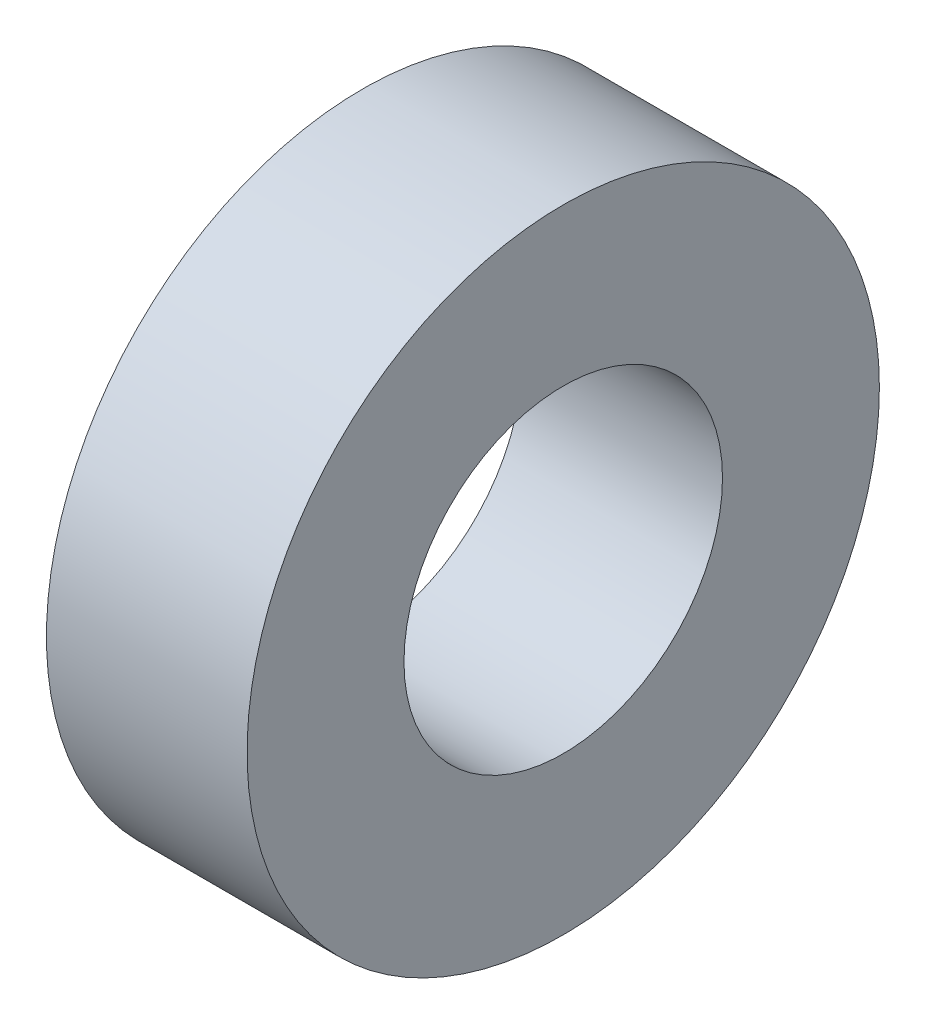
ISO-10303-21;
HEADER;
FILE_DESCRIPTION(('STEP AP214'),'2;1');
FILE_NAME('part.step','',(''),(''),'','','');
FILE_SCHEMA(('AUTOMOTIVE_DESIGN { 1 0 10303 214 1 1 1 1 }'));
ENDSEC;
DATA;
#1=APPLICATION_CONTEXT('core data for automotive mechanical design processes');
#2=APPLICATION_PROTOCOL_DEFINITION('international standard','automotive_design',2000,#1);
#3=PRODUCT_CONTEXT('',#1,'mechanical');
#4=PRODUCT('Part','Part','',(#3));
#5=PRODUCT_RELATED_PRODUCT_CATEGORY('part','',(#4));
#6=PRODUCT_DEFINITION_FORMATION('','',#4);
#7=PRODUCT_DEFINITION_CONTEXT('part definition',#1,'design');
#8=PRODUCT_DEFINITION('design','',#6,#7);
#9=PRODUCT_DEFINITION_SHAPE('','',#8);
#10=(LENGTH_UNIT() NAMED_UNIT(*) SI_UNIT(.MILLI.,.METRE.));
#11=(NAMED_UNIT(*) PLANE_ANGLE_UNIT() SI_UNIT($,.RADIAN.));
#12=(NAMED_UNIT(*) SI_UNIT($,.STERADIAN.) SOLID_ANGLE_UNIT());
#13=UNCERTAINTY_MEASURE_WITH_UNIT(LENGTH_MEASURE(1.E-05),#10,'distance_accuracy_value','');
#14=(GEOMETRIC_REPRESENTATION_CONTEXT(3) GLOBAL_UNCERTAINTY_ASSIGNED_CONTEXT((#13)) GLOBAL_UNIT_ASSIGNED_CONTEXT((#10,
#11,#12)) REPRESENTATION_CONTEXT('',''));
#15=CARTESIAN_POINT('',(0.,0.,0.));
#16=DIRECTION('',(0.,0.,1.));
#17=DIRECTION('',(1.,0.,0.));
#18=AXIS2_PLACEMENT_3D('',#15,#16,#17);
#19=CARTESIAN_POINT('',(1.5,0.,0.));
#20=DIRECTION('',(1.,0.,0.));
#21=DIRECTION('',(0.,0.,-1.));
#22=AXIS2_PLACEMENT_3D('',#19,#20,#21);
#23=PLANE('',#22);
#24=CARTESIAN_POINT('',(1.5,0.,0.));
#25=DIRECTION('',(1.,0.,0.));
#26=DIRECTION('',(0.,0.,-1.));
#27=AXIS2_PLACEMENT_3D('',#24,#25,#26);
#28=CIRCLE('',#27,4.72715786839464);
#29=CARTESIAN_POINT('',(1.5,0.,-4.72715786839464));
#30=VERTEX_POINT('',#29);
#31=EDGE_CURVE('E10',#30,#30,#28,.T.);
#32=ORIENTED_EDGE('',*,*,#31,.T.);
#33=EDGE_LOOP('',(#32));
#34=FACE_BOUND('',#33,.T.);
#35=CARTESIAN_POINT('',(1.5,0.,0.));
#36=DIRECTION('',(1.,0.,0.));
#37=DIRECTION('',(0.,0.,-1.));
#38=AXIS2_PLACEMENT_3D('',#35,#36,#37);
#39=CIRCLE('',#38,2.38125);
#40=CARTESIAN_POINT('',(1.5,0.,-2.38125));
#41=VERTEX_POINT('',#40);
#42=EDGE_CURVE('E44',#41,#41,#39,.T.);
#43=ORIENTED_EDGE('',*,*,#42,.F.);
#44=EDGE_LOOP('',(#43));
#45=FACE_BOUND('',#44,.T.);
#46=ADVANCED_FACE('F33',(#34,#45),#23,.T.);
#47=CARTESIAN_POINT('',(-1.5,0.,0.));
#48=DIRECTION('',(1.,0.,0.));
#49=DIRECTION('',(0.,0.,-1.));
#50=AXIS2_PLACEMENT_3D('',#47,#48,#49);
#51=PLANE('',#50);
#52=CARTESIAN_POINT('',(-1.5,0.,0.));
#53=DIRECTION('',(1.,0.,0.));
#54=DIRECTION('',(0.,0.,-1.));
#55=AXIS2_PLACEMENT_3D('',#52,#53,#54);
#56=CIRCLE('',#55,4.72715786839464);
#57=CARTESIAN_POINT('',(-1.5,0.,-4.72715786839464));
#58=VERTEX_POINT('',#57);
#59=EDGE_CURVE('E37',#58,#58,#56,.T.);
#60=ORIENTED_EDGE('',*,*,#59,.F.);
#61=EDGE_LOOP('',(#60));
#62=FACE_BOUND('',#61,.T.);
#63=CARTESIAN_POINT('',(-1.5,0.,0.));
#64=DIRECTION('',(1.,0.,0.));
#65=DIRECTION('',(0.,0.,-1.));
#66=AXIS2_PLACEMENT_3D('',#63,#64,#65);
#67=CIRCLE('',#66,2.38125);
#68=CARTESIAN_POINT('',(-1.5,0.,-2.38125));
#69=VERTEX_POINT('',#68);
#70=EDGE_CURVE('E46',#69,#69,#67,.T.);
#71=ORIENTED_EDGE('',*,*,#70,.T.);
#72=EDGE_LOOP('',(#71));
#73=FACE_BOUND('',#72,.T.);
#74=ADVANCED_FACE('F56',(#62,#73),#51,.F.);
#75=CARTESIAN_POINT('',(1.5,0.,0.));
#76=DIRECTION('',(-1.,0.,0.));
#77=DIRECTION('',(0.,0.,1.));
#78=AXIS2_PLACEMENT_3D('',#75,#76,#77);
#79=CYLINDRICAL_SURFACE('',#78,4.72715786839464);
#80=ORIENTED_EDGE('',*,*,#31,.F.);
#81=EDGE_LOOP('',(#80));
#82=FACE_BOUND('',#81,.T.);
#83=ORIENTED_EDGE('',*,*,#59,.T.);
#84=EDGE_LOOP('',(#83));
#85=FACE_BOUND('',#84,.T.);
#86=ADVANCED_FACE('F35',(#82,#85),#79,.T.);
#87=CARTESIAN_POINT('',(1.5,0.,0.));
#88=DIRECTION('',(-1.,0.,0.));
#89=DIRECTION('',(0.,0.,1.));
#90=AXIS2_PLACEMENT_3D('',#87,#88,#89);
#91=CYLINDRICAL_SURFACE('',#90,2.38125);
#92=ORIENTED_EDGE('',*,*,#42,.T.);
#93=EDGE_LOOP('',(#92));
#94=FACE_BOUND('',#93,.T.);
#95=ORIENTED_EDGE('',*,*,#70,.F.);
#96=EDGE_LOOP('',(#95));
#97=FACE_BOUND('',#96,.T.);
#98=ADVANCED_FACE('F52',(#94,#97),#91,.F.);
#99=CLOSED_SHELL('',(#46,#74,#86,#98));
#100=MANIFOLD_SOLID_BREP('B2',#99);
#101=ADVANCED_BREP_SHAPE_REPRESENTATION('',(#18,#100),#14);
#102=SHAPE_DEFINITION_REPRESENTATION(#9,#101);
ENDSEC;
END-ISO-10303-21;
